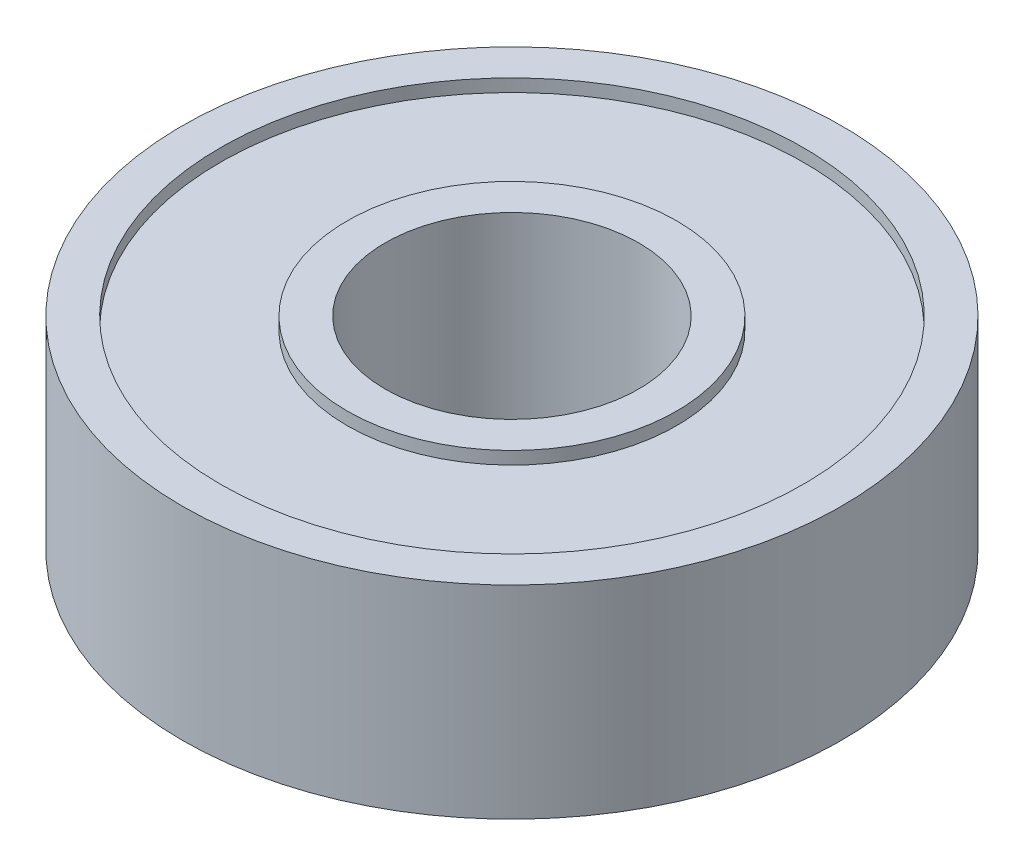
ISO-10303-21;
HEADER;
FILE_DESCRIPTION(('STEP AP214'),'2;1');
FILE_NAME('part.step','',(''),(''),'','','');
FILE_SCHEMA(('AUTOMOTIVE_DESIGN { 1 0 10303 214 1 1 1 1 }'));
ENDSEC;
DATA;
#1=APPLICATION_CONTEXT('core data for automotive mechanical design processes');
#2=APPLICATION_PROTOCOL_DEFINITION('international standard','automotive_design',2000,#1);
#3=PRODUCT_CONTEXT('',#1,'mechanical');
#4=PRODUCT('Part','Part','',(#3));
#5=PRODUCT_RELATED_PRODUCT_CATEGORY('part','',(#4));
#6=PRODUCT_DEFINITION_FORMATION('','',#4);
#7=PRODUCT_DEFINITION_CONTEXT('part definition',#1,'design');
#8=PRODUCT_DEFINITION('design','',#6,#7);
#9=PRODUCT_DEFINITION_SHAPE('','',#8);
#10=(LENGTH_UNIT() NAMED_UNIT(*) SI_UNIT(.MILLI.,.METRE.));
#11=(NAMED_UNIT(*) PLANE_ANGLE_UNIT() SI_UNIT($,.RADIAN.));
#12=(NAMED_UNIT(*) SI_UNIT($,.STERADIAN.) SOLID_ANGLE_UNIT());
#13=UNCERTAINTY_MEASURE_WITH_UNIT(LENGTH_MEASURE(1.E-05),#10,'distance_accuracy_value','');
#14=(GEOMETRIC_REPRESENTATION_CONTEXT(3) GLOBAL_UNCERTAINTY_ASSIGNED_CONTEXT((#13)) GLOBAL_UNIT_ASSIGNED_CONTEXT((#10,
#11,#12)) REPRESENTATION_CONTEXT('',''));
#15=CARTESIAN_POINT('',(0.,0.,0.));
#16=DIRECTION('',(0.,0.,1.));
#17=DIRECTION('',(1.,0.,0.));
#18=AXIS2_PLACEMENT_3D('',#15,#16,#17);
#19=CARTESIAN_POINT('',(0.,7.60109496691536,0.));
#20=DIRECTION('',(0.,1.,0.));
#21=DIRECTION('',(0.,0.,1.));
#22=AXIS2_PLACEMENT_3D('',#19,#20,#21);
#23=CYLINDRICAL_SURFACE('',#22,6.5);
#24=CARTESIAN_POINT('',(0.,3.5,0.));
#25=DIRECTION('',(0.,1.,0.));
#26=DIRECTION('',(0.,0.,1.));
#27=AXIS2_PLACEMENT_3D('',#24,#25,#26);
#28=CIRCLE('',#27,6.5);
#29=CARTESIAN_POINT('',(0.,3.5,6.5));
#30=VERTEX_POINT('',#29);
#31=EDGE_CURVE('E52',#30,#30,#28,.T.);
#32=ORIENTED_EDGE('',*,*,#31,.T.);
#33=EDGE_LOOP('',(#32));
#34=FACE_BOUND('',#33,.T.);
#35=CARTESIAN_POINT('',(0.,4.,0.));
#36=DIRECTION('',(0.,1.,0.));
#37=DIRECTION('',(0.,0.,1.));
#38=AXIS2_PLACEMENT_3D('',#35,#36,#37);
#39=CIRCLE('',#38,6.5);
#40=CARTESIAN_POINT('',(0.,4.,6.5));
#41=VERTEX_POINT('',#40);
#42=EDGE_CURVE('E43',#41,#41,#39,.T.);
#43=ORIENTED_EDGE('',*,*,#42,.F.);
#44=EDGE_LOOP('',(#43));
#45=FACE_BOUND('',#44,.T.);
#46=ADVANCED_FACE('F32',(#34,#45),#23,.T.);
#47=CARTESIAN_POINT('',(0.,7.60109496691536,0.));
#48=DIRECTION('',(0.,1.,0.));
#49=DIRECTION('',(0.,0.,1.));
#50=AXIS2_PLACEMENT_3D('',#47,#48,#49);
#51=CYLINDRICAL_SURFACE('',#50,5.);
#52=CARTESIAN_POINT('',(0.,-4.,0.));
#53=DIRECTION('',(0.,1.,0.));
#54=DIRECTION('',(0.,0.,1.));
#55=AXIS2_PLACEMENT_3D('',#52,#53,#54);
#56=CIRCLE('',#55,5.);
#57=CARTESIAN_POINT('',(0.,-4.,5.));
#58=VERTEX_POINT('',#57);
#59=EDGE_CURVE('E10',#58,#58,#56,.T.);
#60=ORIENTED_EDGE('',*,*,#59,.F.);
#61=EDGE_LOOP('',(#60));
#62=FACE_BOUND('',#61,.T.);
#63=CARTESIAN_POINT('',(0.,4.,0.));
#64=DIRECTION('',(0.,1.,0.));
#65=DIRECTION('',(0.,0.,1.));
#66=AXIS2_PLACEMENT_3D('',#63,#64,#65);
#67=CIRCLE('',#66,5.);
#68=CARTESIAN_POINT('',(0.,4.,5.));
#69=VERTEX_POINT('',#68);
#70=EDGE_CURVE('E47',#69,#69,#67,.T.);
#71=ORIENTED_EDGE('',*,*,#70,.T.);
#72=EDGE_LOOP('',(#71));
#73=FACE_BOUND('',#72,.T.);
#74=ADVANCED_FACE('F34',(#62,#73),#51,.F.);
#75=CARTESIAN_POINT('',(5.,-4.,0.));
#76=DIRECTION('',(0.,1.,0.));
#77=DIRECTION('',(0.,0.,1.));
#78=AXIS2_PLACEMENT_3D('',#75,#76,#77);
#79=PLANE('',#78);
#80=CARTESIAN_POINT('',(0.,-4.,0.));
#81=DIRECTION('',(0.,1.,0.));
#82=DIRECTION('',(0.,0.,1.));
#83=AXIS2_PLACEMENT_3D('',#80,#81,#82);
#84=CIRCLE('',#83,6.5);
#85=CARTESIAN_POINT('',(0.,-4.,6.5));
#86=VERTEX_POINT('',#85);
#87=EDGE_CURVE('E39',#86,#86,#84,.T.);
#88=ORIENTED_EDGE('',*,*,#87,.F.);
#89=EDGE_LOOP('',(#88));
#90=FACE_BOUND('',#89,.T.);
#91=ORIENTED_EDGE('',*,*,#59,.T.);
#92=EDGE_LOOP('',(#91));
#93=FACE_BOUND('',#92,.T.);
#94=ADVANCED_FACE('F114',(#90,#93),#79,.F.);
#95=CARTESIAN_POINT('',(0.,-3.5,0.));
#96=DIRECTION('',(0.,1.,0.));
#97=DIRECTION('',(0.,0.,1.));
#98=AXIS2_PLACEMENT_3D('',#95,#96,#97);
#99=CIRCLE('',#98,6.5);
#100=CARTESIAN_POINT('',(0.,-3.5,6.5));
#101=VERTEX_POINT('',#100);
#102=EDGE_CURVE('E58',#101,#101,#99,.T.);
#103=ORIENTED_EDGE('',*,*,#102,.F.);
#104=EDGE_LOOP('',(#103));
#105=FACE_BOUND('',#104,.T.);
#106=ORIENTED_EDGE('',*,*,#87,.T.);
#107=EDGE_LOOP('',(#106));
#108=FACE_BOUND('',#107,.T.);
#109=ADVANCED_FACE('F110',(#105,#108),#23,.T.);
#110=CARTESIAN_POINT('',(5.,4.,0.));
#111=DIRECTION('',(0.,-1.,0.));
#112=DIRECTION('',(0.,0.,-1.));
#113=AXIS2_PLACEMENT_3D('',#110,#111,#112);
#114=PLANE('',#113);
#115=ORIENTED_EDGE('',*,*,#70,.F.);
#116=EDGE_LOOP('',(#115));
#117=FACE_BOUND('',#116,.T.);
#118=ORIENTED_EDGE('',*,*,#42,.T.);
#119=EDGE_LOOP('',(#118));
#120=FACE_BOUND('',#119,.T.);
#121=ADVANCED_FACE('F119',(#117,#120),#114,.F.);
#122=CARTESIAN_POINT('',(-6.5,3.5,0.));
#123=DIRECTION('',(0.,1.,0.));
#124=DIRECTION('',(0.,0.,1.));
#125=AXIS2_PLACEMENT_3D('',#122,#123,#124);
#126=PLANE('',#125);
#127=CARTESIAN_POINT('',(0.,3.5,0.));
#128=DIRECTION('',(0.,1.,0.));
#129=DIRECTION('',(0.,0.,1.));
#130=AXIS2_PLACEMENT_3D('',#127,#128,#129);
#131=CIRCLE('',#130,11.5);
#132=CARTESIAN_POINT('',(0.,3.5,11.5));
#133=VERTEX_POINT('',#132);
#134=EDGE_CURVE('E61',#133,#133,#131,.T.);
#135=ORIENTED_EDGE('',*,*,#134,.T.);
#136=EDGE_LOOP('',(#135));
#137=FACE_BOUND('',#136,.T.);
#138=ORIENTED_EDGE('',*,*,#31,.F.);
#139=EDGE_LOOP('',(#138));
#140=FACE_BOUND('',#139,.T.);
#141=ADVANCED_FACE('F125',(#137,#140),#126,.T.);
#142=CARTESIAN_POINT('',(-11.5,-3.5,0.));
#143=DIRECTION('',(0.,-1.,0.));
#144=DIRECTION('',(0.,0.,-1.));
#145=AXIS2_PLACEMENT_3D('',#142,#143,#144);
#146=PLANE('',#145);
#147=ORIENTED_EDGE('',*,*,#102,.T.);
#148=EDGE_LOOP('',(#147));
#149=FACE_BOUND('',#148,.T.);
#150=CARTESIAN_POINT('',(0.,-3.5,0.));
#151=DIRECTION('',(0.,1.,0.));
#152=DIRECTION('',(0.,0.,1.));
#153=AXIS2_PLACEMENT_3D('',#150,#151,#152);
#154=CIRCLE('',#153,11.5);
#155=CARTESIAN_POINT('',(0.,-3.5,11.5));
#156=VERTEX_POINT('',#155);
#157=EDGE_CURVE('E55',#156,#156,#154,.T.);
#158=ORIENTED_EDGE('',*,*,#157,.F.);
#159=EDGE_LOOP('',(#158));
#160=FACE_BOUND('',#159,.T.);
#161=ADVANCED_FACE('F104',(#149,#160),#146,.T.);
#162=CARTESIAN_POINT('',(0.,7.60109496691536,0.));
#163=DIRECTION('',(0.,1.,0.));
#164=DIRECTION('',(0.,0.,1.));
#165=AXIS2_PLACEMENT_3D('',#162,#163,#164);
#166=CYLINDRICAL_SURFACE('',#165,11.5);
#167=ORIENTED_EDGE('',*,*,#134,.F.);
#168=EDGE_LOOP('',(#167));
#169=FACE_BOUND('',#168,.T.);
#170=CARTESIAN_POINT('',(0.,4.,0.));
#171=DIRECTION('',(0.,1.,0.));
#172=DIRECTION('',(0.,0.,1.));
#173=AXIS2_PLACEMENT_3D('',#170,#171,#172);
#174=CIRCLE('',#173,11.5);
#175=CARTESIAN_POINT('',(0.,4.,11.5));
#176=VERTEX_POINT('',#175);
#177=EDGE_CURVE('E73',#176,#176,#174,.T.);
#178=ORIENTED_EDGE('',*,*,#177,.T.);
#179=EDGE_LOOP('',(#178));
#180=FACE_BOUND('',#179,.T.);
#181=ADVANCED_FACE('F77',(#169,#180),#166,.F.);
#182=ORIENTED_EDGE('',*,*,#157,.T.);
#183=EDGE_LOOP('',(#182));
#184=FACE_BOUND('',#183,.T.);
#185=CARTESIAN_POINT('',(0.,-4.,0.));
#186=DIRECTION('',(0.,1.,0.));
#187=DIRECTION('',(0.,0.,1.));
#188=AXIS2_PLACEMENT_3D('',#185,#186,#187);
#189=CIRCLE('',#188,11.5);
#190=CARTESIAN_POINT('',(0.,-4.,11.5));
#191=VERTEX_POINT('',#190);
#192=EDGE_CURVE('E64',#191,#191,#189,.T.);
#193=ORIENTED_EDGE('',*,*,#192,.F.);
#194=EDGE_LOOP('',(#193));
#195=FACE_BOUND('',#194,.T.);
#196=ADVANCED_FACE('F94',(#184,#195),#166,.F.);
#197=CARTESIAN_POINT('',(11.5,-4.,0.));
#198=DIRECTION('',(0.,1.,0.));
#199=DIRECTION('',(0.,0.,1.));
#200=AXIS2_PLACEMENT_3D('',#197,#198,#199);
#201=PLANE('',#200);
#202=CARTESIAN_POINT('',(0.,-4.,0.));
#203=DIRECTION('',(0.,1.,0.));
#204=DIRECTION('',(0.,0.,1.));
#205=AXIS2_PLACEMENT_3D('',#202,#203,#204);
#206=CIRCLE('',#205,13.);
#207=CARTESIAN_POINT('',(0.,-4.,13.));
#208=VERTEX_POINT('',#207);
#209=EDGE_CURVE('E67',#208,#208,#206,.T.);
#210=ORIENTED_EDGE('',*,*,#209,.F.);
#211=EDGE_LOOP('',(#210));
#212=FACE_BOUND('',#211,.T.);
#213=ORIENTED_EDGE('',*,*,#192,.T.);
#214=EDGE_LOOP('',(#213));
#215=FACE_BOUND('',#214,.T.);
#216=ADVANCED_FACE('F88',(#212,#215),#201,.F.);
#217=CARTESIAN_POINT('',(0.,7.60109496691536,0.));
#218=DIRECTION('',(0.,1.,0.));
#219=DIRECTION('',(0.,0.,1.));
#220=AXIS2_PLACEMENT_3D('',#217,#218,#219);
#221=CYLINDRICAL_SURFACE('',#220,13.);
#222=CARTESIAN_POINT('',(0.,4.,0.));
#223=DIRECTION('',(0.,1.,0.));
#224=DIRECTION('',(0.,0.,1.));
#225=AXIS2_PLACEMENT_3D('',#222,#223,#224);
#226=CIRCLE('',#225,13.);
#227=CARTESIAN_POINT('',(0.,4.,13.));
#228=VERTEX_POINT('',#227);
#229=EDGE_CURVE('E70',#228,#228,#226,.T.);
#230=ORIENTED_EDGE('',*,*,#229,.F.);
#231=EDGE_LOOP('',(#230));
#232=FACE_BOUND('',#231,.T.);
#233=ORIENTED_EDGE('',*,*,#209,.T.);
#234=EDGE_LOOP('',(#233));
#235=FACE_BOUND('',#234,.T.);
#236=ADVANCED_FACE('F82',(#232,#235),#221,.T.);
#237=CARTESIAN_POINT('',(11.5,4.,0.));
#238=DIRECTION('',(0.,-1.,0.));
#239=DIRECTION('',(0.,0.,-1.));
#240=AXIS2_PLACEMENT_3D('',#237,#238,#239);
#241=PLANE('',#240);
#242=ORIENTED_EDGE('',*,*,#177,.F.);
#243=EDGE_LOOP('',(#242));
#244=FACE_BOUND('',#243,.T.);
#245=ORIENTED_EDGE('',*,*,#229,.T.);
#246=EDGE_LOOP('',(#245));
#247=FACE_BOUND('',#246,.T.);
#248=ADVANCED_FACE('F79',(#244,#247),#241,.F.);
#249=CLOSED_SHELL('',(#46,#74,#94,#109,#121,#141,#161,#181,#196,#216,#236,#248));
#250=MANIFOLD_SOLID_BREP('B2',#249);
#251=ADVANCED_BREP_SHAPE_REPRESENTATION('',(#18,#250),#14);
#252=SHAPE_DEFINITION_REPRESENTATION(#9,#251);
ENDSEC;
END-ISO-10303-21;
